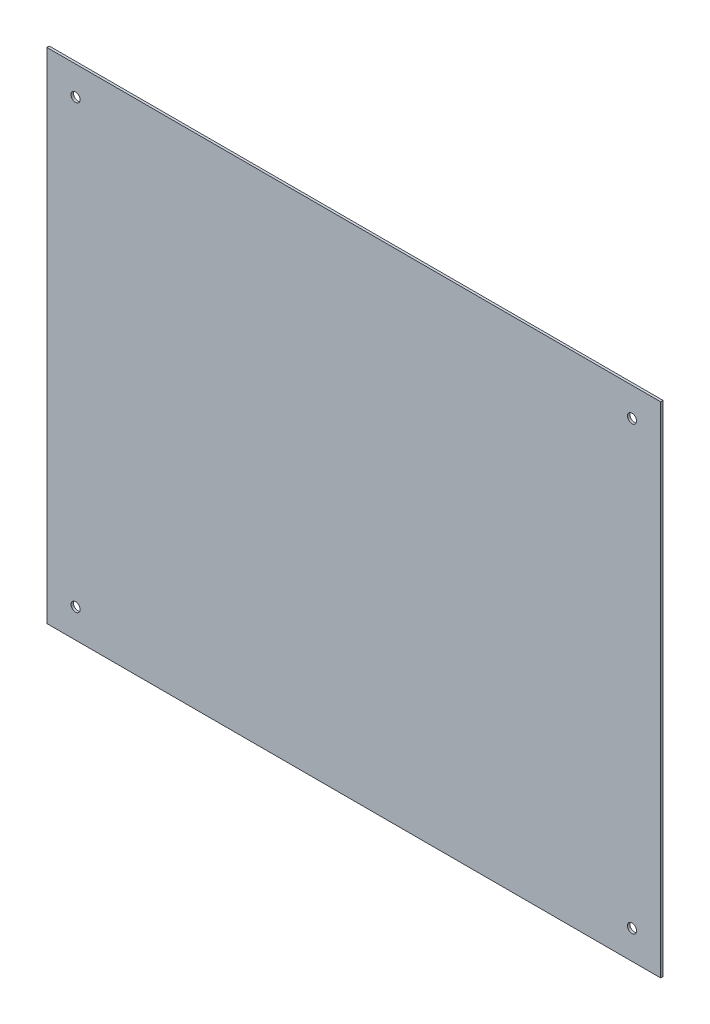
ISO-10303-21;
HEADER;
FILE_DESCRIPTION(('STEP AP214'),'2;1');
FILE_NAME('part.step','',(''),(''),'','','');
FILE_SCHEMA(('AUTOMOTIVE_DESIGN { 1 0 10303 214 1 1 1 1 }'));
ENDSEC;
DATA;
#1=APPLICATION_CONTEXT('core data for automotive mechanical design processes');
#2=APPLICATION_PROTOCOL_DEFINITION('international standard','automotive_design',2000,#1);
#3=PRODUCT_CONTEXT('',#1,'mechanical');
#4=PRODUCT('Part','Part','',(#3));
#5=PRODUCT_RELATED_PRODUCT_CATEGORY('part','',(#4));
#6=PRODUCT_DEFINITION_FORMATION('','',#4);
#7=PRODUCT_DEFINITION_CONTEXT('part definition',#1,'design');
#8=PRODUCT_DEFINITION('design','',#6,#7);
#9=PRODUCT_DEFINITION_SHAPE('','',#8);
#10=(LENGTH_UNIT() NAMED_UNIT(*) SI_UNIT(.MILLI.,.METRE.));
#11=(NAMED_UNIT(*) PLANE_ANGLE_UNIT() SI_UNIT($,.RADIAN.));
#12=(NAMED_UNIT(*) SI_UNIT($,.STERADIAN.) SOLID_ANGLE_UNIT());
#13=UNCERTAINTY_MEASURE_WITH_UNIT(LENGTH_MEASURE(1.E-05),#10,'distance_accuracy_value','');
#14=(GEOMETRIC_REPRESENTATION_CONTEXT(3) GLOBAL_UNCERTAINTY_ASSIGNED_CONTEXT((#13)) GLOBAL_UNIT_ASSIGNED_CONTEXT((#10,
#11,#12)) REPRESENTATION_CONTEXT('',''));
#15=CARTESIAN_POINT('',(0.,0.,0.));
#16=DIRECTION('',(0.,0.,1.));
#17=DIRECTION('',(1.,0.,0.));
#18=AXIS2_PLACEMENT_3D('',#15,#16,#17);
#19=CARTESIAN_POINT('',(-101.5,-82.5,0.4));
#20=DIRECTION('',(0.,0.,1.));
#21=DIRECTION('',(1.,0.,0.));
#22=AXIS2_PLACEMENT_3D('',#19,#20,#21);
#23=PLANE('',#22);
#24=CARTESIAN_POINT('',(-92.0000000000001,-73.,0.4));
#25=DIRECTION('',(0.,0.,-1.));
#26=DIRECTION('',(1.,0.,0.));
#27=AXIS2_PLACEMENT_3D('',#24,#25,#26);
#28=CIRCLE('',#27,1.5);
#29=CARTESIAN_POINT('',(-90.5000000000001,-73.,0.4));
#30=VERTEX_POINT('',#29);
#31=EDGE_CURVE('E117',#30,#30,#28,.T.);
#32=ORIENTED_EDGE('',*,*,#31,.T.);
#33=EDGE_LOOP('',(#32));
#34=FACE_BOUND('',#33,.T.);
#35=CARTESIAN_POINT('',(-92.0000000000001,73.,0.4));
#36=DIRECTION('',(0.,0.,1.));
#37=DIRECTION('',(1.,0.,0.));
#38=AXIS2_PLACEMENT_3D('',#35,#36,#37);
#39=CIRCLE('',#38,1.5);
#40=CARTESIAN_POINT('',(-90.5000000000001,73.,0.4));
#41=VERTEX_POINT('',#40);
#42=EDGE_CURVE('E111',#41,#41,#39,.T.);
#43=ORIENTED_EDGE('',*,*,#42,.F.);
#44=EDGE_LOOP('',(#43));
#45=FACE_BOUND('',#44,.T.);
#46=DIRECTION('',(0.,-1.,0.));
#47=VECTOR('',#46,1.);
#48=CARTESIAN_POINT('',(-101.5,82.5,0.4));
#49=LINE('',#48,#47);
#50=CARTESIAN_POINT('',(-101.5,82.5,0.4));
#51=VERTEX_POINT('',#50);
#52=CARTESIAN_POINT('',(-101.5,-82.5,0.4));
#53=VERTEX_POINT('',#52);
#54=EDGE_CURVE('E84',#51,#53,#49,.T.);
#55=ORIENTED_EDGE('',*,*,#54,.T.);
#56=DIRECTION('',(1.,0.,0.));
#57=VECTOR('',#56,1.);
#58=CARTESIAN_POINT('',(-101.5,-82.5,0.4));
#59=LINE('',#58,#57);
#60=CARTESIAN_POINT('',(101.5,-82.5,0.4));
#61=VERTEX_POINT('',#60);
#62=EDGE_CURVE('E79',#53,#61,#59,.T.);
#63=ORIENTED_EDGE('',*,*,#62,.T.);
#64=DIRECTION('',(0.,1.,0.));
#65=VECTOR('',#64,1.);
#66=CARTESIAN_POINT('',(101.5,82.5,0.4));
#67=LINE('',#66,#65);
#68=CARTESIAN_POINT('',(101.5,82.5,0.4));
#69=VERTEX_POINT('',#68);
#70=EDGE_CURVE('E82',#61,#69,#67,.T.);
#71=ORIENTED_EDGE('',*,*,#70,.T.);
#72=DIRECTION('',(-1.,0.,0.));
#73=VECTOR('',#72,1.);
#74=CARTESIAN_POINT('',(-101.5,82.5,0.4));
#75=LINE('',#74,#73);
#76=EDGE_CURVE('E49',#69,#51,#75,.T.);
#77=ORIENTED_EDGE('',*,*,#76,.T.);
#78=EDGE_LOOP('',(#55,#63,#71,#77));
#79=FACE_BOUND('',#78,.T.);
#80=CARTESIAN_POINT('',(92.0000000000001,-73.,0.4));
#81=DIRECTION('',(0.,0.,1.));
#82=DIRECTION('',(-1.,0.,0.));
#83=AXIS2_PLACEMENT_3D('',#80,#81,#82);
#84=CIRCLE('',#83,1.5);
#85=CARTESIAN_POINT('',(90.5000000000001,-73.,0.4));
#86=VERTEX_POINT('',#85);
#87=EDGE_CURVE('E123',#86,#86,#84,.T.);
#88=ORIENTED_EDGE('',*,*,#87,.F.);
#89=EDGE_LOOP('',(#88));
#90=FACE_BOUND('',#89,.T.);
#91=CARTESIAN_POINT('',(92.0000000000001,73.,0.4));
#92=DIRECTION('',(0.,0.,-1.));
#93=DIRECTION('',(-1.,0.,0.));
#94=AXIS2_PLACEMENT_3D('',#91,#92,#93);
#95=CIRCLE('',#94,1.5);
#96=CARTESIAN_POINT('',(90.5000000000001,73.,0.4));
#97=VERTEX_POINT('',#96);
#98=EDGE_CURVE('E129',#97,#97,#95,.T.);
#99=ORIENTED_EDGE('',*,*,#98,.T.);
#100=EDGE_LOOP('',(#99));
#101=FACE_BOUND('',#100,.T.);
#102=ADVANCED_FACE('F32',(#34,#45,#79,#90,#101),#23,.T.);
#103=CARTESIAN_POINT('',(-101.5,-82.5,-0.4));
#104=DIRECTION('',(0.,0.,1.));
#105=DIRECTION('',(1.,0.,0.));
#106=AXIS2_PLACEMENT_3D('',#103,#104,#105);
#107=PLANE('',#106);
#108=CARTESIAN_POINT('',(-92.0000000000001,-73.,-0.4));
#109=DIRECTION('',(0.,0.,-1.));
#110=DIRECTION('',(1.,0.,0.));
#111=AXIS2_PLACEMENT_3D('',#108,#109,#110);
#112=CIRCLE('',#111,1.5);
#113=CARTESIAN_POINT('',(-90.5000000000001,-73.,-0.4));
#114=VERTEX_POINT('',#113);
#115=EDGE_CURVE('E114',#114,#114,#112,.T.);
#116=ORIENTED_EDGE('',*,*,#115,.F.);
#117=EDGE_LOOP('',(#116));
#118=FACE_BOUND('',#117,.T.);
#119=CARTESIAN_POINT('',(-92.0000000000001,73.,-0.4));
#120=DIRECTION('',(0.,0.,1.));
#121=DIRECTION('',(1.,0.,0.));
#122=AXIS2_PLACEMENT_3D('',#119,#120,#121);
#123=CIRCLE('',#122,1.5);
#124=CARTESIAN_POINT('',(-90.5000000000001,73.,-0.4));
#125=VERTEX_POINT('',#124);
#126=EDGE_CURVE('E99',#125,#125,#123,.T.);
#127=ORIENTED_EDGE('',*,*,#126,.T.);
#128=EDGE_LOOP('',(#127));
#129=FACE_BOUND('',#128,.T.);
#130=DIRECTION('',(0.,-1.,0.));
#131=VECTOR('',#130,1.);
#132=CARTESIAN_POINT('',(-101.5,82.5,-0.4));
#133=LINE('',#132,#131);
#134=CARTESIAN_POINT('',(-101.5,82.5,-0.4));
#135=VERTEX_POINT('',#134);
#136=CARTESIAN_POINT('',(-101.5,-82.5,-0.4));
#137=VERTEX_POINT('',#136);
#138=EDGE_CURVE('E96',#135,#137,#133,.T.);
#139=ORIENTED_EDGE('',*,*,#138,.F.);
#140=DIRECTION('',(-1.,0.,0.));
#141=VECTOR('',#140,1.);
#142=CARTESIAN_POINT('',(-101.5,82.5,-0.4));
#143=LINE('',#142,#141);
#144=CARTESIAN_POINT('',(101.5,82.5,-0.4));
#145=VERTEX_POINT('',#144);
#146=EDGE_CURVE('E72',#145,#135,#143,.T.);
#147=ORIENTED_EDGE('',*,*,#146,.F.);
#148=DIRECTION('',(0.,1.,0.));
#149=VECTOR('',#148,1.);
#150=CARTESIAN_POINT('',(101.5,82.5,-0.4));
#151=LINE('',#150,#149);
#152=CARTESIAN_POINT('',(101.5,-82.5,-0.4));
#153=VERTEX_POINT('',#152);
#154=EDGE_CURVE('E66',#153,#145,#151,.T.);
#155=ORIENTED_EDGE('',*,*,#154,.F.);
#156=DIRECTION('',(1.,0.,0.));
#157=VECTOR('',#156,1.);
#158=CARTESIAN_POINT('',(-101.5,-82.5,-0.4));
#159=LINE('',#158,#157);
#160=EDGE_CURVE('E88',#137,#153,#159,.T.);
#161=ORIENTED_EDGE('',*,*,#160,.F.);
#162=EDGE_LOOP('',(#139,#147,#155,#161));
#163=FACE_BOUND('',#162,.T.);
#164=CARTESIAN_POINT('',(92.0000000000001,-73.,-0.4));
#165=DIRECTION('',(0.,0.,1.));
#166=DIRECTION('',(-1.,0.,0.));
#167=AXIS2_PLACEMENT_3D('',#164,#165,#166);
#168=CIRCLE('',#167,1.5);
#169=CARTESIAN_POINT('',(90.5000000000001,-73.,-0.4));
#170=VERTEX_POINT('',#169);
#171=EDGE_CURVE('E120',#170,#170,#168,.T.);
#172=ORIENTED_EDGE('',*,*,#171,.T.);
#173=EDGE_LOOP('',(#172));
#174=FACE_BOUND('',#173,.T.);
#175=CARTESIAN_POINT('',(92.0000000000001,73.,-0.4));
#176=DIRECTION('',(0.,0.,-1.));
#177=DIRECTION('',(-1.,0.,0.));
#178=AXIS2_PLACEMENT_3D('',#175,#176,#177);
#179=CIRCLE('',#178,1.5);
#180=CARTESIAN_POINT('',(90.5000000000001,73.,-0.4));
#181=VERTEX_POINT('',#180);
#182=EDGE_CURVE('E126',#181,#181,#179,.T.);
#183=ORIENTED_EDGE('',*,*,#182,.F.);
#184=EDGE_LOOP('',(#183));
#185=FACE_BOUND('',#184,.T.);
#186=ADVANCED_FACE('F107',(#118,#129,#163,#174,#185),#107,.F.);
#187=CARTESIAN_POINT('',(-101.5,82.5,0.4));
#188=DIRECTION('',(1.,0.,0.));
#189=DIRECTION('',(0.,1.,0.));
#190=AXIS2_PLACEMENT_3D('',#187,#188,#189);
#191=PLANE('',#190);
#192=ORIENTED_EDGE('',*,*,#138,.T.);
#193=DIRECTION('',(0.,0.,-1.));
#194=VECTOR('',#193,1.);
#195=CARTESIAN_POINT('',(-101.5,-82.5,0.4));
#196=LINE('',#195,#194);
#197=EDGE_CURVE('E11',#53,#137,#196,.T.);
#198=ORIENTED_EDGE('',*,*,#197,.F.);
#199=ORIENTED_EDGE('',*,*,#54,.F.);
#200=DIRECTION('',(0.,0.,-1.));
#201=VECTOR('',#200,1.);
#202=CARTESIAN_POINT('',(-101.5,82.5,0.4));
#203=LINE('',#202,#201);
#204=EDGE_CURVE('E92',#51,#135,#203,.T.);
#205=ORIENTED_EDGE('',*,*,#204,.T.);
#206=EDGE_LOOP('',(#192,#198,#199,#205));
#207=FACE_BOUND('',#206,.T.);
#208=ADVANCED_FACE('F34',(#207),#191,.F.);
#209=CARTESIAN_POINT('',(-101.5,-82.5,0.4));
#210=DIRECTION('',(0.,1.,0.));
#211=DIRECTION('',(0.,0.,1.));
#212=AXIS2_PLACEMENT_3D('',#209,#210,#211);
#213=PLANE('',#212);
#214=ORIENTED_EDGE('',*,*,#160,.T.);
#215=DIRECTION('',(0.,0.,-1.));
#216=VECTOR('',#215,1.);
#217=CARTESIAN_POINT('',(101.5,-82.5,0.4));
#218=LINE('',#217,#216);
#219=EDGE_CURVE('E41',#61,#153,#218,.T.);
#220=ORIENTED_EDGE('',*,*,#219,.F.);
#221=ORIENTED_EDGE('',*,*,#62,.F.);
#222=ORIENTED_EDGE('',*,*,#197,.T.);
#223=EDGE_LOOP('',(#214,#220,#221,#222));
#224=FACE_BOUND('',#223,.T.);
#225=ADVANCED_FACE('F87',(#224),#213,.F.);
#226=CARTESIAN_POINT('',(101.5,82.5,0.4));
#227=DIRECTION('',(-1.,0.,0.));
#228=DIRECTION('',(0.,-1.,0.));
#229=AXIS2_PLACEMENT_3D('',#226,#227,#228);
#230=PLANE('',#229);
#231=ORIENTED_EDGE('',*,*,#154,.T.);
#232=DIRECTION('',(0.,0.,-1.));
#233=VECTOR('',#232,1.);
#234=CARTESIAN_POINT('',(101.5,82.5,0.4));
#235=LINE('',#234,#233);
#236=EDGE_CURVE('E89',#69,#145,#235,.T.);
#237=ORIENTED_EDGE('',*,*,#236,.F.);
#238=ORIENTED_EDGE('',*,*,#70,.F.);
#239=ORIENTED_EDGE('',*,*,#219,.T.);
#240=EDGE_LOOP('',(#231,#237,#238,#239));
#241=FACE_BOUND('',#240,.T.);
#242=ADVANCED_FACE('F90',(#241),#230,.F.);
#243=CARTESIAN_POINT('',(-101.5,82.5,0.4));
#244=DIRECTION('',(0.,-1.,0.));
#245=DIRECTION('',(0.,0.,-1.));
#246=AXIS2_PLACEMENT_3D('',#243,#244,#245);
#247=PLANE('',#246);
#248=ORIENTED_EDGE('',*,*,#146,.T.);
#249=ORIENTED_EDGE('',*,*,#204,.F.);
#250=ORIENTED_EDGE('',*,*,#76,.F.);
#251=ORIENTED_EDGE('',*,*,#236,.T.);
#252=EDGE_LOOP('',(#248,#249,#250,#251));
#253=FACE_BOUND('',#252,.T.);
#254=ADVANCED_FACE('F104',(#253),#247,.F.);
#255=CARTESIAN_POINT('',(-92.0000000000001,73.,-0.4));
#256=DIRECTION('',(0.,0.,1.));
#257=DIRECTION('',(1.,0.,0.));
#258=AXIS2_PLACEMENT_3D('',#255,#256,#257);
#259=CYLINDRICAL_SURFACE('',#258,1.5);
#260=ORIENTED_EDGE('',*,*,#126,.F.);
#261=EDGE_LOOP('',(#260));
#262=FACE_BOUND('',#261,.T.);
#263=ORIENTED_EDGE('',*,*,#42,.T.);
#264=EDGE_LOOP('',(#263));
#265=FACE_BOUND('',#264,.T.);
#266=ADVANCED_FACE('F153',(#262,#265),#259,.F.);
#267=CARTESIAN_POINT('',(-92.0000000000001,-73.,-0.4));
#268=DIRECTION('',(0.,0.,1.));
#269=DIRECTION('',(1.,0.,0.));
#270=AXIS2_PLACEMENT_3D('',#267,#268,#269);
#271=CYLINDRICAL_SURFACE('',#270,1.5);
#272=ORIENTED_EDGE('',*,*,#115,.T.);
#273=EDGE_LOOP('',(#272));
#274=FACE_BOUND('',#273,.T.);
#275=ORIENTED_EDGE('',*,*,#31,.F.);
#276=EDGE_LOOP('',(#275));
#277=FACE_BOUND('',#276,.T.);
#278=ADVANCED_FACE('F174',(#274,#277),#271,.F.);
#279=CARTESIAN_POINT('',(92.0000000000001,-73.,-0.4));
#280=DIRECTION('',(0.,0.,1.));
#281=DIRECTION('',(1.,0.,0.));
#282=AXIS2_PLACEMENT_3D('',#279,#280,#281);
#283=CYLINDRICAL_SURFACE('',#282,1.5);
#284=ORIENTED_EDGE('',*,*,#171,.F.);
#285=EDGE_LOOP('',(#284));
#286=FACE_BOUND('',#285,.T.);
#287=ORIENTED_EDGE('',*,*,#87,.T.);
#288=EDGE_LOOP('',(#287));
#289=FACE_BOUND('',#288,.T.);
#290=ADVANCED_FACE('F181',(#286,#289),#283,.F.);
#291=CARTESIAN_POINT('',(92.0000000000001,73.,-0.4));
#292=DIRECTION('',(0.,0.,1.));
#293=DIRECTION('',(1.,0.,0.));
#294=AXIS2_PLACEMENT_3D('',#291,#292,#293);
#295=CYLINDRICAL_SURFACE('',#294,1.5);
#296=ORIENTED_EDGE('',*,*,#182,.T.);
#297=EDGE_LOOP('',(#296));
#298=FACE_BOUND('',#297,.T.);
#299=ORIENTED_EDGE('',*,*,#98,.F.);
#300=EDGE_LOOP('',(#299));
#301=FACE_BOUND('',#300,.T.);
#302=ADVANCED_FACE('F135',(#298,#301),#295,.F.);
#303=CLOSED_SHELL('',(#102,#186,#208,#225,#242,#254,#266,#278,#290,#302));
#304=MANIFOLD_SOLID_BREP('B2',#303);
#305=ADVANCED_BREP_SHAPE_REPRESENTATION('',(#18,#304),#14);
#306=SHAPE_DEFINITION_REPRESENTATION(#9,#305);
ENDSEC;
END-ISO-10303-21;
